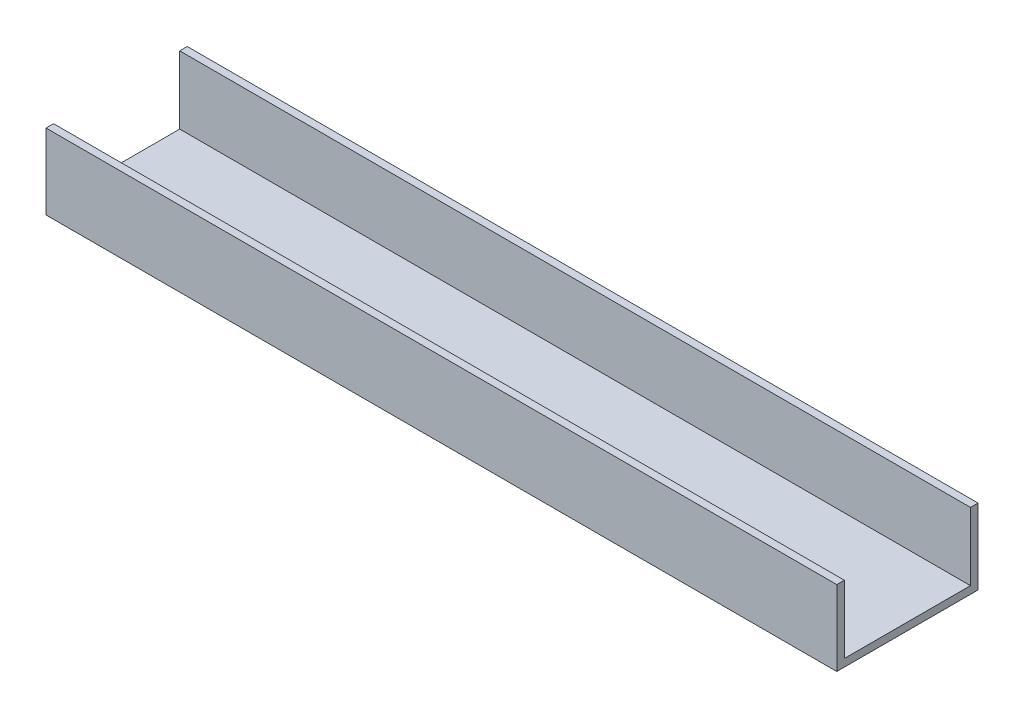
ISO-10303-21;
HEADER;
FILE_DESCRIPTION(('STEP AP214'),'2;1');
FILE_NAME('part.step','',(''),(''),'','','');
FILE_SCHEMA(('AUTOMOTIVE_DESIGN { 1 0 10303 214 1 1 1 1 }'));
ENDSEC;
DATA;
#1=APPLICATION_CONTEXT('core data for automotive mechanical design processes');
#2=APPLICATION_PROTOCOL_DEFINITION('international standard','automotive_design',2000,#1);
#3=PRODUCT_CONTEXT('',#1,'mechanical');
#4=PRODUCT('Part','Part','',(#3));
#5=PRODUCT_RELATED_PRODUCT_CATEGORY('part','',(#4));
#6=PRODUCT_DEFINITION_FORMATION('','',#4);
#7=PRODUCT_DEFINITION_CONTEXT('part definition',#1,'design');
#8=PRODUCT_DEFINITION('design','',#6,#7);
#9=PRODUCT_DEFINITION_SHAPE('','',#8);
#10=(LENGTH_UNIT() NAMED_UNIT(*) SI_UNIT(.MILLI.,.METRE.));
#11=(NAMED_UNIT(*) PLANE_ANGLE_UNIT() SI_UNIT($,.RADIAN.));
#12=(NAMED_UNIT(*) SI_UNIT($,.STERADIAN.) SOLID_ANGLE_UNIT());
#13=UNCERTAINTY_MEASURE_WITH_UNIT(LENGTH_MEASURE(1.E-05),#10,'distance_accuracy_value','');
#14=(GEOMETRIC_REPRESENTATION_CONTEXT(3) GLOBAL_UNCERTAINTY_ASSIGNED_CONTEXT((#13)) GLOBAL_UNIT_ASSIGNED_CONTEXT((#10,
#11,#12)) REPRESENTATION_CONTEXT('',''));
#15=CARTESIAN_POINT('',(0.,0.,0.));
#16=DIRECTION('',(0.,0.,1.));
#17=DIRECTION('',(1.,0.,0.));
#18=AXIS2_PLACEMENT_3D('',#15,#16,#17);
#19=CARTESIAN_POINT('',(0.,4.,0.));
#20=DIRECTION('',(0.,-1.,0.));
#21=DIRECTION('',(0.,0.,-1.));
#22=AXIS2_PLACEMENT_3D('',#19,#20,#21);
#23=PLANE('',#22);
#24=DIRECTION('',(1.,0.,0.));
#25=VECTOR('',#24,1.);
#26=CARTESIAN_POINT('',(420.,4.,-71.));
#27=LINE('',#26,#25);
#28=CARTESIAN_POINT('',(0.,4.,-70.9999999999999));
#29=VERTEX_POINT('',#28);
#30=CARTESIAN_POINT('',(420.,4.,-70.9999999999999));
#31=VERTEX_POINT('',#30);
#32=EDGE_CURVE('E61',#29,#31,#27,.T.);
#33=ORIENTED_EDGE('',*,*,#32,.F.);
#34=DIRECTION('',(0.,0.,1.));
#35=VECTOR('',#34,1.);
#36=CARTESIAN_POINT('',(0.,4.,0.));
#37=LINE('',#36,#35);
#38=CARTESIAN_POINT('',(0.,4.,-4.));
#39=VERTEX_POINT('',#38);
#40=EDGE_CURVE('E169',#29,#39,#37,.T.);
#41=ORIENTED_EDGE('',*,*,#40,.T.);
#42=DIRECTION('',(-1.,0.,0.));
#43=VECTOR('',#42,1.);
#44=CARTESIAN_POINT('',(0.,4.,-4.));
#45=LINE('',#44,#43);
#46=CARTESIAN_POINT('',(420.,4.,-4.));
#47=VERTEX_POINT('',#46);
#48=EDGE_CURVE('E138',#47,#39,#45,.T.);
#49=ORIENTED_EDGE('',*,*,#48,.F.);
#50=DIRECTION('',(0.,0.,-1.));
#51=VECTOR('',#50,1.);
#52=CARTESIAN_POINT('',(420.,4.,0.));
#53=LINE('',#52,#51);
#54=EDGE_CURVE('E66',#47,#31,#53,.T.);
#55=ORIENTED_EDGE('',*,*,#54,.T.);
#56=EDGE_LOOP('',(#33,#41,#49,#55));
#57=FACE_BOUND('',#56,.T.);
#58=ADVANCED_FACE('F45',(#57),#23,.F.);
#59=CARTESIAN_POINT('',(0.,4.,0.));
#60=DIRECTION('',(1.,0.,0.));
#61=DIRECTION('',(0.,0.,-1.));
#62=AXIS2_PLACEMENT_3D('',#59,#60,#61);
#63=PLANE('',#62);
#64=DIRECTION('',(0.,0.,1.));
#65=VECTOR('',#64,1.);
#66=CARTESIAN_POINT('',(0.,0.,0.));
#67=LINE('',#66,#65);
#68=CARTESIAN_POINT('',(0.,0.,-75.));
#69=VERTEX_POINT('',#68);
#70=CARTESIAN_POINT('',(0.,0.,0.));
#71=VERTEX_POINT('',#70);
#72=EDGE_CURVE('E168',#69,#71,#67,.T.);
#73=ORIENTED_EDGE('',*,*,#72,.T.);
#74=DIRECTION('',(0.,-1.,0.));
#75=VECTOR('',#74,1.);
#76=CARTESIAN_POINT('',(0.,4.,0.));
#77=LINE('',#76,#75);
#78=CARTESIAN_POINT('',(0.,40.,0.));
#79=VERTEX_POINT('',#78);
#80=EDGE_CURVE('E11',#79,#71,#77,.T.);
#81=ORIENTED_EDGE('',*,*,#80,.F.);
#82=DIRECTION('',(0.,0.,1.));
#83=VECTOR('',#82,1.);
#84=CARTESIAN_POINT('',(0.,40.,0.));
#85=LINE('',#84,#83);
#86=CARTESIAN_POINT('',(0.,40.,-4.));
#87=VERTEX_POINT('',#86);
#88=EDGE_CURVE('E143',#87,#79,#85,.T.);
#89=ORIENTED_EDGE('',*,*,#88,.F.);
#90=DIRECTION('',(0.,-1.,0.));
#91=VECTOR('',#90,1.);
#92=CARTESIAN_POINT('',(0.,40.,-4.));
#93=LINE('',#92,#91);
#94=EDGE_CURVE('E157',#87,#39,#93,.T.);
#95=ORIENTED_EDGE('',*,*,#94,.T.);
#96=ORIENTED_EDGE('',*,*,#40,.F.);
#97=DIRECTION('',(0.,-1.,0.));
#98=VECTOR('',#97,1.);
#99=CARTESIAN_POINT('',(0.,40.,-70.9999999999999));
#100=LINE('',#99,#98);
#101=CARTESIAN_POINT('',(0.,40.,-70.9999999999999));
#102=VERTEX_POINT('',#101);
#103=EDGE_CURVE('E127',#102,#29,#100,.T.);
#104=ORIENTED_EDGE('',*,*,#103,.F.);
#105=DIRECTION('',(0.,0.,1.));
#106=VECTOR('',#105,1.);
#107=CARTESIAN_POINT('',(0.,40.,-75.));
#108=LINE('',#107,#106);
#109=CARTESIAN_POINT('',(0.,40.,-75.));
#110=VERTEX_POINT('',#109);
#111=EDGE_CURVE('E116',#110,#102,#108,.T.);
#112=ORIENTED_EDGE('',*,*,#111,.F.);
#113=DIRECTION('',(0.,-1.,0.));
#114=VECTOR('',#113,1.);
#115=CARTESIAN_POINT('',(0.,4.,-75.));
#116=LINE('',#115,#114);
#117=EDGE_CURVE('E175',#110,#69,#116,.T.);
#118=ORIENTED_EDGE('',*,*,#117,.T.);
#119=EDGE_LOOP('',(#73,#81,#89,#95,#96,#104,#112,#118));
#120=FACE_BOUND('',#119,.T.);
#121=ADVANCED_FACE('F47',(#120),#63,.F.);
#122=CARTESIAN_POINT('',(0.,4.,0.));
#123=DIRECTION('',(0.,0.,-1.));
#124=DIRECTION('',(-1.,0.,0.));
#125=AXIS2_PLACEMENT_3D('',#122,#123,#124);
#126=PLANE('',#125);
#127=DIRECTION('',(1.,0.,0.));
#128=VECTOR('',#127,1.);
#129=CARTESIAN_POINT('',(0.,0.,0.));
#130=LINE('',#129,#128);
#131=CARTESIAN_POINT('',(420.,0.,0.));
#132=VERTEX_POINT('',#131);
#133=EDGE_CURVE('E179',#71,#132,#130,.T.);
#134=ORIENTED_EDGE('',*,*,#133,.T.);
#135=DIRECTION('',(0.,-1.,0.));
#136=VECTOR('',#135,1.);
#137=CARTESIAN_POINT('',(420.,4.,0.));
#138=LINE('',#137,#136);
#139=CARTESIAN_POINT('',(420.,40.,0.));
#140=VERTEX_POINT('',#139);
#141=EDGE_CURVE('E54',#140,#132,#138,.T.);
#142=ORIENTED_EDGE('',*,*,#141,.F.);
#143=DIRECTION('',(1.,0.,0.));
#144=VECTOR('',#143,1.);
#145=CARTESIAN_POINT('',(0.,40.,0.));
#146=LINE('',#145,#144);
#147=EDGE_CURVE('E147',#79,#140,#146,.T.);
#148=ORIENTED_EDGE('',*,*,#147,.F.);
#149=ORIENTED_EDGE('',*,*,#80,.T.);
#150=EDGE_LOOP('',(#134,#142,#148,#149));
#151=FACE_BOUND('',#150,.T.);
#152=ADVANCED_FACE('F215',(#151),#126,.F.);
#153=CARTESIAN_POINT('',(420.,4.,0.));
#154=DIRECTION('',(-1.,0.,0.));
#155=DIRECTION('',(0.,0.,1.));
#156=AXIS2_PLACEMENT_3D('',#153,#154,#155);
#157=PLANE('',#156);
#158=DIRECTION('',(0.,0.,-1.));
#159=VECTOR('',#158,1.);
#160=CARTESIAN_POINT('',(420.,0.,0.));
#161=LINE('',#160,#159);
#162=CARTESIAN_POINT('',(420.,0.,-75.));
#163=VERTEX_POINT('',#162);
#164=EDGE_CURVE('E182',#132,#163,#161,.T.);
#165=ORIENTED_EDGE('',*,*,#164,.T.);
#166=DIRECTION('',(0.,-1.,0.));
#167=VECTOR('',#166,1.);
#168=CARTESIAN_POINT('',(420.,4.,-75.));
#169=LINE('',#168,#167);
#170=CARTESIAN_POINT('',(420.,40.,-75.));
#171=VERTEX_POINT('',#170);
#172=EDGE_CURVE('E131',#171,#163,#169,.T.);
#173=ORIENTED_EDGE('',*,*,#172,.F.);
#174=DIRECTION('',(0.,0.,-1.));
#175=VECTOR('',#174,1.);
#176=CARTESIAN_POINT('',(420.,40.,-75.));
#177=LINE('',#176,#175);
#178=CARTESIAN_POINT('',(420.,40.,-71.));
#179=VERTEX_POINT('',#178);
#180=EDGE_CURVE('E114',#179,#171,#177,.T.);
#181=ORIENTED_EDGE('',*,*,#180,.F.);
#182=DIRECTION('',(0.,-1.,0.));
#183=VECTOR('',#182,1.);
#184=CARTESIAN_POINT('',(420.,40.,-71.));
#185=LINE('',#184,#183);
#186=EDGE_CURVE('E121',#179,#31,#185,.T.);
#187=ORIENTED_EDGE('',*,*,#186,.T.);
#188=ORIENTED_EDGE('',*,*,#54,.F.);
#189=DIRECTION('',(0.,-1.,0.));
#190=VECTOR('',#189,1.);
#191=CARTESIAN_POINT('',(420.,40.,-4.));
#192=LINE('',#191,#190);
#193=CARTESIAN_POINT('',(420.,40.,-4.));
#194=VERTEX_POINT('',#193);
#195=EDGE_CURVE('E164',#194,#47,#192,.T.);
#196=ORIENTED_EDGE('',*,*,#195,.F.);
#197=DIRECTION('',(0.,0.,-1.));
#198=VECTOR('',#197,1.);
#199=CARTESIAN_POINT('',(420.,40.,0.));
#200=LINE('',#199,#198);
#201=EDGE_CURVE('E151',#140,#194,#200,.T.);
#202=ORIENTED_EDGE('',*,*,#201,.F.);
#203=ORIENTED_EDGE('',*,*,#141,.T.);
#204=EDGE_LOOP('',(#165,#173,#181,#187,#188,#196,#202,#203));
#205=FACE_BOUND('',#204,.T.);
#206=ADVANCED_FACE('F129',(#205),#157,.F.);
#207=CARTESIAN_POINT('',(0.,4.,-75.));
#208=DIRECTION('',(0.,0.,1.));
#209=DIRECTION('',(1.,0.,0.));
#210=AXIS2_PLACEMENT_3D('',#207,#208,#209);
#211=PLANE('',#210);
#212=DIRECTION('',(-1.,0.,0.));
#213=VECTOR('',#212,1.);
#214=CARTESIAN_POINT('',(0.,0.,-75.));
#215=LINE('',#214,#213);
#216=EDGE_CURVE('E172',#163,#69,#215,.T.);
#217=ORIENTED_EDGE('',*,*,#216,.T.);
#218=ORIENTED_EDGE('',*,*,#117,.F.);
#219=DIRECTION('',(-1.,0.,0.));
#220=VECTOR('',#219,1.);
#221=CARTESIAN_POINT('',(420.,40.,-75.));
#222=LINE('',#221,#220);
#223=EDGE_CURVE('E134',#171,#110,#222,.T.);
#224=ORIENTED_EDGE('',*,*,#223,.F.);
#225=ORIENTED_EDGE('',*,*,#172,.T.);
#226=EDGE_LOOP('',(#217,#218,#224,#225));
#227=FACE_BOUND('',#226,.T.);
#228=ADVANCED_FACE('F203',(#227),#211,.F.);
#229=CARTESIAN_POINT('',(0.,0.,0.));
#230=DIRECTION('',(0.,-1.,0.));
#231=DIRECTION('',(0.,0.,-1.));
#232=AXIS2_PLACEMENT_3D('',#229,#230,#231);
#233=PLANE('',#232);
#234=ORIENTED_EDGE('',*,*,#72,.F.);
#235=ORIENTED_EDGE('',*,*,#216,.F.);
#236=ORIENTED_EDGE('',*,*,#164,.F.);
#237=ORIENTED_EDGE('',*,*,#133,.F.);
#238=EDGE_LOOP('',(#234,#235,#236,#237));
#239=FACE_BOUND('',#238,.T.);
#240=ADVANCED_FACE('F201',(#239),#233,.T.);
#241=CARTESIAN_POINT('',(0.,40.,-4.));
#242=DIRECTION('',(0.,0.,1.));
#243=DIRECTION('',(1.,0.,0.));
#244=AXIS2_PLACEMENT_3D('',#241,#242,#243);
#245=PLANE('',#244);
#246=ORIENTED_EDGE('',*,*,#48,.T.);
#247=ORIENTED_EDGE('',*,*,#94,.F.);
#248=DIRECTION('',(-1.,0.,0.));
#249=VECTOR('',#248,1.);
#250=CARTESIAN_POINT('',(0.,40.,-4.));
#251=LINE('',#250,#249);
#252=EDGE_CURVE('E154',#194,#87,#251,.T.);
#253=ORIENTED_EDGE('',*,*,#252,.F.);
#254=ORIENTED_EDGE('',*,*,#195,.T.);
#255=EDGE_LOOP('',(#246,#247,#253,#254));
#256=FACE_BOUND('',#255,.T.);
#257=ADVANCED_FACE('F211',(#256),#245,.F.);
#258=CARTESIAN_POINT('',(0.,40.,0.));
#259=DIRECTION('',(0.,-1.,0.));
#260=DIRECTION('',(0.,0.,-1.));
#261=AXIS2_PLACEMENT_3D('',#258,#259,#260);
#262=PLANE('',#261);
#263=ORIENTED_EDGE('',*,*,#88,.T.);
#264=ORIENTED_EDGE('',*,*,#147,.T.);
#265=ORIENTED_EDGE('',*,*,#201,.T.);
#266=ORIENTED_EDGE('',*,*,#252,.T.);
#267=EDGE_LOOP('',(#263,#264,#265,#266));
#268=FACE_BOUND('',#267,.T.);
#269=ADVANCED_FACE('F214',(#268),#262,.F.);
#270=CARTESIAN_POINT('',(420.,40.,-71.));
#271=DIRECTION('',(0.,0.,-1.));
#272=DIRECTION('',(-1.,0.,0.));
#273=AXIS2_PLACEMENT_3D('',#270,#271,#272);
#274=PLANE('',#273);
#275=ORIENTED_EDGE('',*,*,#32,.T.);
#276=ORIENTED_EDGE('',*,*,#186,.F.);
#277=DIRECTION('',(1.,0.,0.));
#278=VECTOR('',#277,1.);
#279=CARTESIAN_POINT('',(420.,40.,-71.));
#280=LINE('',#279,#278);
#281=EDGE_CURVE('E109',#102,#179,#280,.T.);
#282=ORIENTED_EDGE('',*,*,#281,.F.);
#283=ORIENTED_EDGE('',*,*,#103,.T.);
#284=EDGE_LOOP('',(#275,#276,#282,#283));
#285=FACE_BOUND('',#284,.T.);
#286=ADVANCED_FACE('F124',(#285),#274,.F.);
#287=CARTESIAN_POINT('',(0.,40.,0.));
#288=DIRECTION('',(0.,-1.,0.));
#289=DIRECTION('',(0.,0.,-1.));
#290=AXIS2_PLACEMENT_3D('',#287,#288,#289);
#291=PLANE('',#290);
#292=ORIENTED_EDGE('',*,*,#180,.T.);
#293=ORIENTED_EDGE('',*,*,#223,.T.);
#294=ORIENTED_EDGE('',*,*,#111,.T.);
#295=ORIENTED_EDGE('',*,*,#281,.T.);
#296=EDGE_LOOP('',(#292,#293,#294,#295));
#297=FACE_BOUND('',#296,.T.);
#298=ADVANCED_FACE('F111',(#297),#291,.F.);
#299=CLOSED_SHELL('',(#58,#121,#152,#206,#228,#240,#257,#269,#286,#298));
#300=MANIFOLD_SOLID_BREP('B2',#299);
#301=ADVANCED_BREP_SHAPE_REPRESENTATION('',(#18,#300),#14);
#302=SHAPE_DEFINITION_REPRESENTATION(#9,#301);
ENDSEC;
END-ISO-10303-21;
